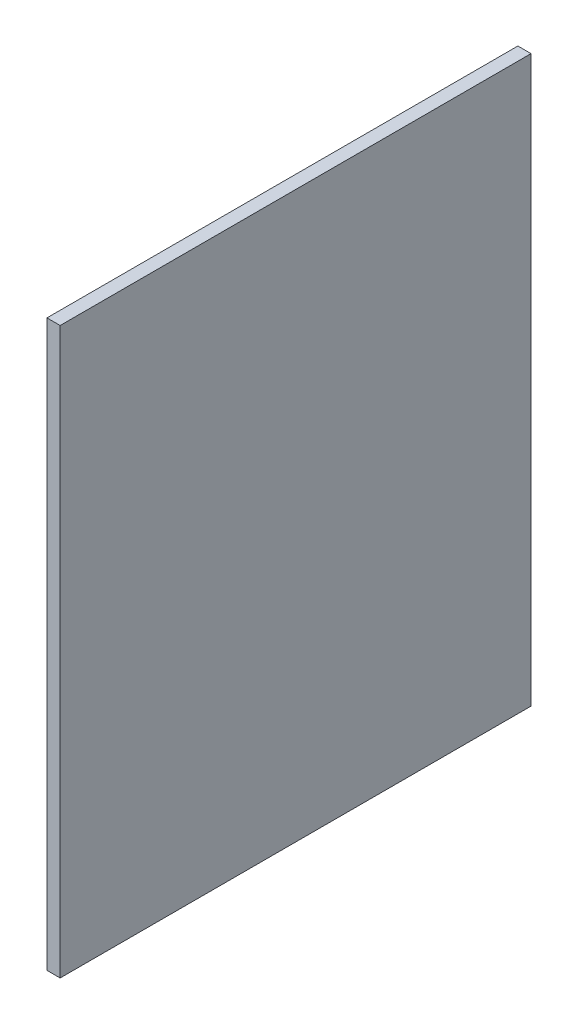
ISO-10303-21;
HEADER;
FILE_DESCRIPTION(('STEP AP214'),'2;1');
FILE_NAME('part.step','',(''),(''),'','','');
FILE_SCHEMA(('AUTOMOTIVE_DESIGN { 1 0 10303 214 1 1 1 1 }'));
ENDSEC;
DATA;
#1=APPLICATION_CONTEXT('core data for automotive mechanical design processes');
#2=APPLICATION_PROTOCOL_DEFINITION('international standard','automotive_design',2000,#1);
#3=PRODUCT_CONTEXT('',#1,'mechanical');
#4=PRODUCT('Part','Part','',(#3));
#5=PRODUCT_RELATED_PRODUCT_CATEGORY('part','',(#4));
#6=PRODUCT_DEFINITION_FORMATION('','',#4);
#7=PRODUCT_DEFINITION_CONTEXT('part definition',#1,'design');
#8=PRODUCT_DEFINITION('design','',#6,#7);
#9=PRODUCT_DEFINITION_SHAPE('','',#8);
#10=(LENGTH_UNIT() NAMED_UNIT(*) SI_UNIT(.MILLI.,.METRE.));
#11=(NAMED_UNIT(*) PLANE_ANGLE_UNIT() SI_UNIT($,.RADIAN.));
#12=(NAMED_UNIT(*) SI_UNIT($,.STERADIAN.) SOLID_ANGLE_UNIT());
#13=UNCERTAINTY_MEASURE_WITH_UNIT(LENGTH_MEASURE(1.E-05),#10,'distance_accuracy_value','');
#14=(GEOMETRIC_REPRESENTATION_CONTEXT(3) GLOBAL_UNCERTAINTY_ASSIGNED_CONTEXT((#13)) GLOBAL_UNIT_ASSIGNED_CONTEXT((#10,
#11,#12)) REPRESENTATION_CONTEXT('',''));
#15=CARTESIAN_POINT('',(0.,0.,0.));
#16=DIRECTION('',(0.,0.,1.));
#17=DIRECTION('',(1.,0.,0.));
#18=AXIS2_PLACEMENT_3D('',#15,#16,#17);
#19=CARTESIAN_POINT('',(35.0000000000004,-1500.,2500.));
#20=DIRECTION('',(0.,-1.,0.));
#21=DIRECTION('',(0.,0.,-1.));
#22=AXIS2_PLACEMENT_3D('',#19,#20,#21);
#23=PLANE('',#22);
#24=DIRECTION('',(-1.,0.,0.));
#25=VECTOR('',#24,1.);
#26=CARTESIAN_POINT('',(35.0000000000004,-1500.,0.));
#27=LINE('',#26,#25);
#28=CARTESIAN_POINT('',(35.0000000000004,-1500.,0.));
#29=VERTEX_POINT('',#28);
#30=CARTESIAN_POINT('',(-34.9999999999996,-1500.,0.));
#31=VERTEX_POINT('',#30);
#32=EDGE_CURVE('E102',#29,#31,#27,.T.);
#33=ORIENTED_EDGE('',*,*,#32,.F.);
#34=DIRECTION('',(0.,0.,-1.));
#35=VECTOR('',#34,1.);
#36=CARTESIAN_POINT('',(35.0000000000004,-1500.,2500.));
#37=LINE('',#36,#35);
#38=CARTESIAN_POINT('',(35.0000000000004,-1500.,2500.));
#39=VERTEX_POINT('',#38);
#40=EDGE_CURVE('E11',#39,#29,#37,.T.);
#41=ORIENTED_EDGE('',*,*,#40,.F.);
#42=DIRECTION('',(-1.,0.,0.));
#43=VECTOR('',#42,1.);
#44=CARTESIAN_POINT('',(35.0000000000004,-1500.,2500.));
#45=LINE('',#44,#43);
#46=CARTESIAN_POINT('',(-34.9999999999996,-1500.,2500.));
#47=VERTEX_POINT('',#46);
#48=EDGE_CURVE('E97',#39,#47,#45,.T.);
#49=ORIENTED_EDGE('',*,*,#48,.T.);
#50=DIRECTION('',(0.,0.,-1.));
#51=VECTOR('',#50,1.);
#52=CARTESIAN_POINT('',(-34.9999999999996,-1500.,2500.));
#53=LINE('',#52,#51);
#54=EDGE_CURVE('E40',#47,#31,#53,.T.);
#55=ORIENTED_EDGE('',*,*,#54,.T.);
#56=EDGE_LOOP('',(#33,#41,#49,#55));
#57=FACE_BOUND('',#56,.T.);
#58=ADVANCED_FACE('F37',(#57),#23,.T.);
#59=CARTESIAN_POINT('',(35.0000000000004,-1500.,2500.));
#60=DIRECTION('',(-1.,0.,0.));
#61=DIRECTION('',(0.,-1.,0.));
#62=AXIS2_PLACEMENT_3D('',#59,#60,#61);
#63=PLANE('',#62);
#64=DIRECTION('',(0.,1.,0.));
#65=VECTOR('',#64,1.);
#66=CARTESIAN_POINT('',(35.0000000000004,-1500.,0.));
#67=LINE('',#66,#65);
#68=CARTESIAN_POINT('',(34.9999999999996,1500.,0.));
#69=VERTEX_POINT('',#68);
#70=EDGE_CURVE('E70',#29,#69,#67,.T.);
#71=ORIENTED_EDGE('',*,*,#70,.T.);
#72=DIRECTION('',(0.,0.,-1.));
#73=VECTOR('',#72,1.);
#74=CARTESIAN_POINT('',(34.9999999999996,1500.,2500.));
#75=LINE('',#74,#73);
#76=CARTESIAN_POINT('',(34.9999999999996,1500.,2500.));
#77=VERTEX_POINT('',#76);
#78=EDGE_CURVE('E46',#77,#69,#75,.T.);
#79=ORIENTED_EDGE('',*,*,#78,.F.);
#80=DIRECTION('',(0.,1.,0.));
#81=VECTOR('',#80,1.);
#82=CARTESIAN_POINT('',(35.0000000000004,-1500.,2500.));
#83=LINE('',#82,#81);
#84=EDGE_CURVE('E87',#39,#77,#83,.T.);
#85=ORIENTED_EDGE('',*,*,#84,.F.);
#86=ORIENTED_EDGE('',*,*,#40,.T.);
#87=EDGE_LOOP('',(#71,#79,#85,#86));
#88=FACE_BOUND('',#87,.T.);
#89=ADVANCED_FACE('F112',(#88),#63,.F.);
#90=CARTESIAN_POINT('',(34.9999999999996,1500.,2500.));
#91=DIRECTION('',(0.,-1.,0.));
#92=DIRECTION('',(0.,0.,-1.));
#93=AXIS2_PLACEMENT_3D('',#90,#91,#92);
#94=PLANE('',#93);
#95=DIRECTION('',(-1.,0.,0.));
#96=VECTOR('',#95,1.);
#97=CARTESIAN_POINT('',(34.9999999999996,1500.,0.));
#98=LINE('',#97,#96);
#99=CARTESIAN_POINT('',(-34.9999999999996,1500.,0.));
#100=VERTEX_POINT('',#99);
#101=EDGE_CURVE('E94',#69,#100,#98,.T.);
#102=ORIENTED_EDGE('',*,*,#101,.T.);
#103=DIRECTION('',(0.,0.,-1.));
#104=VECTOR('',#103,1.);
#105=CARTESIAN_POINT('',(-34.9999999999996,1500.,2500.));
#106=LINE('',#105,#104);
#107=CARTESIAN_POINT('',(-34.9999999999996,1500.,2500.));
#108=VERTEX_POINT('',#107);
#109=EDGE_CURVE('E91',#108,#100,#106,.T.);
#110=ORIENTED_EDGE('',*,*,#109,.F.);
#111=DIRECTION('',(-1.,0.,0.));
#112=VECTOR('',#111,1.);
#113=CARTESIAN_POINT('',(34.9999999999996,1500.,2500.));
#114=LINE('',#113,#112);
#115=EDGE_CURVE('E82',#77,#108,#114,.T.);
#116=ORIENTED_EDGE('',*,*,#115,.F.);
#117=ORIENTED_EDGE('',*,*,#78,.T.);
#118=EDGE_LOOP('',(#102,#110,#116,#117));
#119=FACE_BOUND('',#118,.T.);
#120=ADVANCED_FACE('F92',(#119),#94,.F.);
#121=CARTESIAN_POINT('',(-34.9999999999996,-1500.,2500.));
#122=DIRECTION('',(-1.,0.,0.));
#123=DIRECTION('',(0.,0.,1.));
#124=AXIS2_PLACEMENT_3D('',#121,#122,#123);
#125=PLANE('',#124);
#126=DIRECTION('',(0.,1.,0.));
#127=VECTOR('',#126,1.);
#128=CARTESIAN_POINT('',(-34.9999999999996,-1500.,0.));
#129=LINE('',#128,#127);
#130=EDGE_CURVE('E105',#31,#100,#129,.T.);
#131=ORIENTED_EDGE('',*,*,#130,.F.);
#132=ORIENTED_EDGE('',*,*,#54,.F.);
#133=DIRECTION('',(0.,1.,0.));
#134=VECTOR('',#133,1.);
#135=CARTESIAN_POINT('',(-34.9999999999996,-1500.,2500.));
#136=LINE('',#135,#134);
#137=EDGE_CURVE('E86',#47,#108,#136,.T.);
#138=ORIENTED_EDGE('',*,*,#137,.T.);
#139=ORIENTED_EDGE('',*,*,#109,.T.);
#140=EDGE_LOOP('',(#131,#132,#138,#139));
#141=FACE_BOUND('',#140,.T.);
#142=ADVANCED_FACE('F96',(#141),#125,.T.);
#143=CARTESIAN_POINT('',(0.,0.,2500.));
#144=DIRECTION('',(0.,0.,-1.));
#145=DIRECTION('',(-1.,0.,0.));
#146=AXIS2_PLACEMENT_3D('',#143,#144,#145);
#147=PLANE('',#146);
#148=ORIENTED_EDGE('',*,*,#48,.F.);
#149=ORIENTED_EDGE('',*,*,#84,.T.);
#150=ORIENTED_EDGE('',*,*,#115,.T.);
#151=ORIENTED_EDGE('',*,*,#137,.F.);
#152=EDGE_LOOP('',(#148,#149,#150,#151));
#153=FACE_BOUND('',#152,.T.);
#154=ADVANCED_FACE('F85',(#153),#147,.F.);
#155=CARTESIAN_POINT('',(0.,0.,0.));
#156=DIRECTION('',(0.,0.,-1.));
#157=DIRECTION('',(-1.,0.,0.));
#158=AXIS2_PLACEMENT_3D('',#155,#156,#157);
#159=PLANE('',#158);
#160=ORIENTED_EDGE('',*,*,#32,.T.);
#161=ORIENTED_EDGE('',*,*,#130,.T.);
#162=ORIENTED_EDGE('',*,*,#101,.F.);
#163=ORIENTED_EDGE('',*,*,#70,.F.);
#164=EDGE_LOOP('',(#160,#161,#162,#163));
#165=FACE_BOUND('',#164,.T.);
#166=ADVANCED_FACE('F110',(#165),#159,.T.);
#167=CLOSED_SHELL('',(#58,#89,#120,#142,#154,#166));
#168=MANIFOLD_SOLID_BREP('B2',#167);
#169=ADVANCED_BREP_SHAPE_REPRESENTATION('',(#18,#168),#14);
#170=SHAPE_DEFINITION_REPRESENTATION(#9,#169);
ENDSEC;
END-ISO-10303-21;
